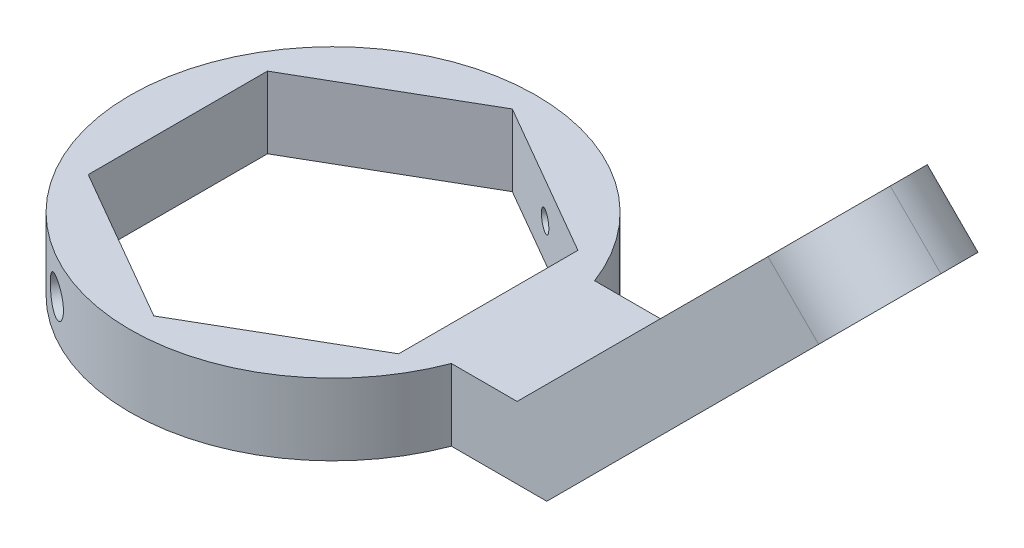
ISO-10303-21;
HEADER;
FILE_DESCRIPTION(('STEP AP214'),'2;1');
FILE_NAME('part.step','',(''),(''),'','','');
FILE_SCHEMA(('AUTOMOTIVE_DESIGN { 1 0 10303 214 1 1 1 1 }'));
ENDSEC;
DATA;
#1=APPLICATION_CONTEXT('core data for automotive mechanical design processes');
#2=APPLICATION_PROTOCOL_DEFINITION('international standard','automotive_design',2000,#1);
#3=PRODUCT_CONTEXT('',#1,'mechanical');
#4=PRODUCT('Part','Part','',(#3));
#5=PRODUCT_RELATED_PRODUCT_CATEGORY('part','',(#4));
#6=PRODUCT_DEFINITION_FORMATION('','',#4);
#7=PRODUCT_DEFINITION_CONTEXT('part definition',#1,'design');
#8=PRODUCT_DEFINITION('design','',#6,#7);
#9=PRODUCT_DEFINITION_SHAPE('','',#8);
#10=(LENGTH_UNIT() NAMED_UNIT(*) SI_UNIT(.MILLI.,.METRE.));
#11=(NAMED_UNIT(*) PLANE_ANGLE_UNIT() SI_UNIT($,.RADIAN.));
#12=(NAMED_UNIT(*) SI_UNIT($,.STERADIAN.) SOLID_ANGLE_UNIT());
#13=UNCERTAINTY_MEASURE_WITH_UNIT(LENGTH_MEASURE(1.E-05),#10,'distance_accuracy_value','');
#14=(GEOMETRIC_REPRESENTATION_CONTEXT(3) GLOBAL_UNCERTAINTY_ASSIGNED_CONTEXT((#13)) GLOBAL_UNIT_ASSIGNED_CONTEXT((#10,
#11,#12)) REPRESENTATION_CONTEXT('',''));
#15=CARTESIAN_POINT('',(0.,0.,0.));
#16=DIRECTION('',(0.,0.,1.));
#17=DIRECTION('',(1.,0.,0.));
#18=AXIS2_PLACEMENT_3D('',#15,#16,#17);
#19=CARTESIAN_POINT('',(0.,12.,0.));
#20=DIRECTION('',(0.,-1.,0.));
#21=DIRECTION('',(0.,0.,-1.));
#22=AXIS2_PLACEMENT_3D('',#19,#20,#21);
#23=CYLINDRICAL_SURFACE('',#22,34.);
#24=CARTESIAN_POINT('',(0.,0.,0.));
#25=DIRECTION('',(0.,1.,0.));
#26=DIRECTION('',(0.,0.,1.));
#27=AXIS2_PLACEMENT_3D('',#24,#25,#26);
#28=CIRCLE('',#27,34.);
#29=CARTESIAN_POINT('',(31.8119474411737,0.,-12.));
#30=VERTEX_POINT('',#29);
#31=CARTESIAN_POINT('',(31.8119474411737,0.,12.));
#32=VERTEX_POINT('',#31);
#33=EDGE_CURVE('E180',#30,#32,#28,.T.);
#34=ORIENTED_EDGE('',*,*,#33,.T.);
#35=DIRECTION('',(0.,-1.,0.));
#36=VECTOR('',#35,1.);
#37=CARTESIAN_POINT('',(31.8119474411737,12.,12.));
#38=LINE('',#37,#36);
#39=CARTESIAN_POINT('',(31.8119474411737,12.,12.));
#40=VERTEX_POINT('',#39);
#41=EDGE_CURVE('E233',#40,#32,#38,.T.);
#42=ORIENTED_EDGE('',*,*,#41,.F.);
#43=CARTESIAN_POINT('',(0.,12.,0.));
#44=DIRECTION('',(0.,1.,0.));
#45=DIRECTION('',(0.,0.,1.));
#46=AXIS2_PLACEMENT_3D('',#43,#44,#45);
#47=CIRCLE('',#46,34.);
#48=CARTESIAN_POINT('',(31.8119474411737,12.,-12.));
#49=VERTEX_POINT('',#48);
#50=EDGE_CURVE('E228',#49,#40,#47,.T.);
#51=ORIENTED_EDGE('',*,*,#50,.F.);
#52=DIRECTION('',(0.,-1.,0.));
#53=VECTOR('',#52,1.);
#54=CARTESIAN_POINT('',(31.8119474411737,12.,-12.));
#55=LINE('',#54,#53);
#56=EDGE_CURVE('E249',#49,#30,#55,.T.);
#57=ORIENTED_EDGE('',*,*,#56,.T.);
#58=EDGE_LOOP('',(#34,#42,#51,#57));
#59=FACE_BOUND('',#58,.T.);
#60=CARTESIAN_POINT('',(19.5317704332293,6.,-27.830018752125));
#61=CARTESIAN_POINT('',(19.5317649613698,6.16815903497814,-27.8300239339166));
#62=CARTESIAN_POINT('',(19.5201176806318,6.33643164423583,-27.8382082143585));
#63=CARTESIAN_POINT('',(19.4737749328198,6.6683183579417,-27.8706451105849));
#64=CARTESIAN_POINT('',(19.4390535471245,6.83192700769336,-27.8949157957835));
#65=CARTESIAN_POINT('',(19.3474211386261,7.14963109542007,-27.9585476731201));
#66=CARTESIAN_POINT('',(19.2905229357072,7.3037319701052,-27.99790014662));
#67=CARTESIAN_POINT('',(19.1559383539736,7.5981371718192,-28.0901521846755));
#68=CARTESIAN_POINT('',(19.0782563323291,7.73844438216431,-28.1430489096817));
#69=CARTESIAN_POINT('',(18.9037762356781,8.00171668159886,-28.2605431914283));
#70=CARTESIAN_POINT('',(18.8069301127904,8.12463682201163,-28.3251701235194));
#71=CARTESIAN_POINT('',(18.5966499580115,8.34925930422787,-28.4636685501938));
#72=CARTESIAN_POINT('',(18.4832151924695,8.45096070712674,-28.5375404536252));
#73=CARTESIAN_POINT('',(18.2424444602952,8.63041022182275,-28.6920491222351));
#74=CARTESIAN_POINT('',(18.1150862089344,8.70811915027042,-28.7726966827462));
#75=CARTESIAN_POINT('',(17.8499653179861,8.83712720805782,-28.9379181872468));
#76=CARTESIAN_POINT('',(17.7122028802147,8.88842684952299,-29.0224920550632));
#77=CARTESIAN_POINT('',(17.4303848491934,8.9630299358413,-29.192613612981));
#78=CARTESIAN_POINT('',(17.2863467143215,8.98640647602842,-29.2781581661385));
#79=CARTESIAN_POINT('',(16.995663635736,9.00472580578764,-29.4478477116573));
#80=CARTESIAN_POINT('',(16.8490187458304,8.99966918159136,-29.5319927328382));
#81=CARTESIAN_POINT('',(16.5577357001919,8.96132537674915,-29.6962839392502));
#82=CARTESIAN_POINT('',(16.4130930956331,8.9281167976441,-29.7764406011236));
#83=CARTESIAN_POINT('',(16.1296126618743,8.83453403526735,-29.9309484054645));
#84=CARTESIAN_POINT('',(15.9907748935588,8.7741595671418,-30.0052994870467));
#85=CARTESIAN_POINT('',(15.722834739252,8.62787162443925,-30.146566354124));
#86=CARTESIAN_POINT('',(15.5937460355973,8.54192306337227,-30.2134717500724));
#87=CARTESIAN_POINT('',(15.3494065860967,8.34695217386185,-30.3383350424967));
#88=CARTESIAN_POINT('',(15.2341561555393,8.23792931985446,-30.3962927351183));
#89=CARTESIAN_POINT('',(15.0206636287877,7.99946185923578,-30.5023597968442));
#90=CARTESIAN_POINT('',(14.9224808264406,7.86994893162906,-30.5504349349692));
#91=CARTESIAN_POINT('',(14.7466960521143,7.59441547999201,-30.6356741370718));
#92=CARTESIAN_POINT('',(14.6690941002381,7.44839493983756,-30.6728381903915));
#93=CARTESIAN_POINT('',(14.5369556991514,7.14394192721177,-30.7356844683052));
#94=CARTESIAN_POINT('',(14.4824226037211,6.98550765398141,-30.7613650234442));
#95=CARTESIAN_POINT('',(14.3982301662586,6.66074831966332,-30.8008628084354));
#96=CARTESIAN_POINT('',(14.3685702369732,6.49442344496996,-30.8146803183732));
#97=CARTESIAN_POINT('',(14.3351671658681,6.15920390069813,-30.8302339817285));
#98=CARTESIAN_POINT('',(14.3313370802111,5.99031977181232,-30.8320106649405));
#99=CARTESIAN_POINT('',(14.3494904008241,5.6542490397517,-30.8235660094671));
#100=CARTESIAN_POINT('',(14.3714735366878,5.48706241881318,-30.8133447964655));
#101=CARTESIAN_POINT('',(14.4404662280679,5.15940801262323,-30.7810715661327));
#102=CARTESIAN_POINT('',(14.4874351826953,4.99892978152493,-30.7590387417165));
#103=CARTESIAN_POINT('',(14.6048396892344,4.68892365623108,-30.7034664367371));
#104=CARTESIAN_POINT('',(14.6752756623604,4.53939595864771,-30.6699267496346));
#105=CARTESIAN_POINT('',(14.8375736638965,4.25509862506024,-30.5917392784767));
#106=CARTESIAN_POINT('',(14.9294921876323,4.12036930379032,-30.5470621839915));
#107=CARTESIAN_POINT('',(15.131755611946,3.86990102366106,-30.4473751095173));
#108=CARTESIAN_POINT('',(15.242100867729,3.75416243096408,-30.3923649303387));
#109=CARTESIAN_POINT('',(15.4781385353261,3.54463389572322,-30.2728383658471));
#110=CARTESIAN_POINT('',(15.603872919827,3.45090611086509,-30.2082958782682));
#111=CARTESIAN_POINT('',(15.8666015441327,3.28848660552547,-30.0711304380419));
#112=CARTESIAN_POINT('',(16.0035956597464,3.21979460895311,-29.9985075745151));
#113=CARTESIAN_POINT('',(16.284523605978,3.10950294936215,-29.8469379864747));
#114=CARTESIAN_POINT('',(16.4284473447589,3.06786509613094,-29.7680003537134));
#115=CARTESIAN_POINT('',(16.7191603564508,3.01273889890919,-29.6056983999315));
#116=CARTESIAN_POINT('',(16.8659495678264,2.99924995109677,-29.522334173905));
#117=CARTESIAN_POINT('',(17.1576461248153,3.00081189851732,-29.3537640023131));
#118=CARTESIAN_POINT('',(17.3025581683226,3.0157660289488,-29.2685652725718));
#119=CARTESIAN_POINT('',(17.5869459810474,3.07358754255125,-29.0985701737762));
#120=CARTESIAN_POINT('',(17.7264217436474,3.11645495969946,-29.0137738052116));
#121=CARTESIAN_POINT('',(17.9961363853677,3.22886096678845,-28.8472566100504));
#122=CARTESIAN_POINT('',(18.126375974515,3.29839750391216,-28.765535547268));
#123=CARTESIAN_POINT('',(18.3742088166986,3.46215705310636,-28.6078669133873));
#124=CARTESIAN_POINT('',(18.4918022347339,3.55637974303279,-28.531919266965));
#125=CARTESIAN_POINT('',(18.7117119901493,3.76720034401749,-28.3881872834287));
#126=CARTESIAN_POINT('',(18.8139773897487,3.88387004062032,-28.3204303036535));
#127=CARTESIAN_POINT('',(19.0002379030546,4.13613887842538,-28.1958073790655));
#128=CARTESIAN_POINT('',(19.0842285977633,4.27174258506649,-28.1389440688423));
#129=CARTESIAN_POINT('',(19.2319890386556,4.55832427288992,-28.0381639573049));
#130=CARTESIAN_POINT('',(19.2957168815561,4.70933327161416,-27.9942739977018));
#131=CARTESIAN_POINT('',(19.4010916941799,5.02211253982181,-27.9213499923651));
#132=CARTESIAN_POINT('',(19.4427639187086,5.18387026144033,-27.8922989566454));
#133=CARTESIAN_POINT('',(19.4924809003155,5.45547664523313,-27.8575612916013));
#134=CARTESIAN_POINT('',(19.5071973378516,5.56358120217121,-27.8472511750996));
#135=CARTESIAN_POINT('',(19.5268438702982,5.78110779821581,-27.8334782292593));
#136=CARTESIAN_POINT('',(19.5317739953653,5.89052983326146,-27.8300153788208));
#137=CARTESIAN_POINT('',(19.5317704332293,6.,-27.830018752125));
#138=B_SPLINE_CURVE_WITH_KNOTS('',3,(#60,#61,#62,#63,#64,#65,#66,#67,#68,#69,#70,#71,#72,#73,
#74,#75,#76,#77,#78,#79,#80,#81,#82,#83,#84,#85,#86,#87,#88,#89,#90,#91,#92,#93,#94,#95,#96,#97,
#98,#99,#100,#101,#102,#103,#104,#105,#106,#107,#108,#109,#110,#111,#112,#113,#114,#115,#116,
#117,#118,#119,#120,#121,#122,#123,#124,#125,#126,#127,#128,#129,#130,#131,#132,#133,#134,#135,
#136,#137),.UNSPECIFIED.,.T.,.F.,(4,2,2,2,2,2,2,2,2,2,2,2,2,2,2,2,2,2,2,2,2,2,2,2,2,2,2,2,2,2,2,
2,2,2,2,2,2,2,4),(0.,0.50407739004379,1.0087219580768,1.51307523487028,2.01732286055947,
2.52285112112668,3.02840174599334,3.53477369693406,4.04113582800653,4.54616951081659,
5.05119278094008,5.55481062959439,6.05843375916665,6.56275104781059,7.06707982454265,
7.57312709501864,8.07917485979014,8.58529616917757,9.09140552874945,9.59581045876575,
10.1002101049382,10.6037926157105,11.1073841658771,11.6123152790278,12.117256126668,
12.6236062069244,13.1299507030602,13.6355788704962,14.141196191596,14.6450964529794,
15.1489973277329,15.6528594232247,16.1567149438524,16.6622094142381,17.1678259824949,
17.6744814585412,18.1805555262344,18.5087068265025,18.836857115569),.UNSPECIFIED.);
#139=CARTESIAN_POINT('',(19.5317704332293,6.,-27.830018752125));
#140=VERTEX_POINT('',#139);
#141=EDGE_CURVE('E280',#140,#140,#138,.T.);
#142=ORIENTED_EDGE('',*,*,#141,.T.);
#143=EDGE_LOOP('',(#142));
#144=FACE_BOUND('',#143,.T.);
#145=CARTESIAN_POINT('',(-19.5317704332293,6.,27.830018752125));
#146=CARTESIAN_POINT('',(-19.5317649613699,5.83184096502186,27.8300239339166));
#147=CARTESIAN_POINT('',(-19.5201176806318,5.66356835576417,27.8382082143585));
#148=CARTESIAN_POINT('',(-19.4737749328198,5.3316816420583,27.8706451105849));
#149=CARTESIAN_POINT('',(-19.4390535471245,5.16807299230664,27.8949157957835));
#150=CARTESIAN_POINT('',(-19.3474211386261,4.85036890457993,27.9585476731201));
#151=CARTESIAN_POINT('',(-19.2905229357072,4.6962680298948,27.99790014662));
#152=CARTESIAN_POINT('',(-19.1559383539737,4.40186282818079,28.0901521846755));
#153=CARTESIAN_POINT('',(-19.0782563323291,4.26155561783568,28.1430489096817));
#154=CARTESIAN_POINT('',(-18.9037762356781,3.99828331840114,28.2605431914283));
#155=CARTESIAN_POINT('',(-18.8069301127904,3.87536317798837,28.3251701235194));
#156=CARTESIAN_POINT('',(-18.5966499580115,3.65074069577213,28.4636685501938));
#157=CARTESIAN_POINT('',(-18.4832151924696,3.54903929287325,28.5375404536252));
#158=CARTESIAN_POINT('',(-18.2424444602952,3.36958977817725,28.6920491222351));
#159=CARTESIAN_POINT('',(-18.1150862089344,3.29188084972958,28.7726966827462));
#160=CARTESIAN_POINT('',(-17.8499653179861,3.16287279194218,28.9379181872468));
#161=CARTESIAN_POINT('',(-17.7122028802147,3.11157315047701,29.0224920550632));
#162=CARTESIAN_POINT('',(-17.4303848491934,3.0369700641587,29.192613612981));
#163=CARTESIAN_POINT('',(-17.2863467143215,3.01359352397158,29.2781581661385));
#164=CARTESIAN_POINT('',(-16.9956636357361,2.99527419421236,29.4478477116573));
#165=CARTESIAN_POINT('',(-16.8490187458304,3.00033081840864,29.5319927328382));
#166=CARTESIAN_POINT('',(-16.5577357001919,3.03867462325085,29.6962839392502));
#167=CARTESIAN_POINT('',(-16.4130930956331,3.0718832023559,29.7764406011236));
#168=CARTESIAN_POINT('',(-16.1296126618743,3.16546596473265,29.9309484054645));
#169=CARTESIAN_POINT('',(-15.9907748935588,3.2258404328582,30.0052994870467));
#170=CARTESIAN_POINT('',(-15.722834739252,3.37212837556075,30.1465663541239));
#171=CARTESIAN_POINT('',(-15.5937460355973,3.45807693662773,30.2134717500724));
#172=CARTESIAN_POINT('',(-15.3494065860967,3.65304782613816,30.3383350424967));
#173=CARTESIAN_POINT('',(-15.2341561555393,3.76207068014554,30.3962927351183));
#174=CARTESIAN_POINT('',(-15.0206636287877,4.00053814076422,30.5023597968441));
#175=CARTESIAN_POINT('',(-14.9224808264406,4.13005106837094,30.5504349349692));
#176=CARTESIAN_POINT('',(-14.7466960521143,4.405584520008,30.6356741370718));
#177=CARTESIAN_POINT('',(-14.6690941002381,4.55160506016244,30.6728381903915));
#178=CARTESIAN_POINT('',(-14.5369556991514,4.85605807278823,30.7356844683051));
#179=CARTESIAN_POINT('',(-14.4824226037211,5.01449234601859,30.7613650234442));
#180=CARTESIAN_POINT('',(-14.3982301662586,5.33925168033668,30.8008628084354));
#181=CARTESIAN_POINT('',(-14.3685702369732,5.50557655503004,30.8146803183731));
#182=CARTESIAN_POINT('',(-14.3351671658681,5.84079609930187,30.8302339817285));
#183=CARTESIAN_POINT('',(-14.3313370802111,6.00968022818769,30.8320106649405));
#184=CARTESIAN_POINT('',(-14.3494904008241,6.3457509602483,30.8235660094671));
#185=CARTESIAN_POINT('',(-14.3714735366878,6.51293758118683,30.8133447964655));
#186=CARTESIAN_POINT('',(-14.4404662280679,6.84059198737677,30.7810715661327));
#187=CARTESIAN_POINT('',(-14.4874351826953,7.00107021847507,30.7590387417165));
#188=CARTESIAN_POINT('',(-14.6048396892344,7.31107634376892,30.7034664367371));
#189=CARTESIAN_POINT('',(-14.6752756623604,7.46060404135229,30.6699267496346));
#190=CARTESIAN_POINT('',(-14.8375736638965,7.74490137493976,30.5917392784767));
#191=CARTESIAN_POINT('',(-14.9294921876324,7.87963069620968,30.5470621839915));
#192=CARTESIAN_POINT('',(-15.131755611946,8.13009897633894,30.4473751095173));
#193=CARTESIAN_POINT('',(-15.242100867729,8.24583756903593,30.3923649303387));
#194=CARTESIAN_POINT('',(-15.4781385353261,8.45536610427679,30.2728383658471));
#195=CARTESIAN_POINT('',(-15.603872919827,8.54909388913492,30.2082958782682));
#196=CARTESIAN_POINT('',(-15.8666015441327,8.71151339447454,30.0711304380419));
#197=CARTESIAN_POINT('',(-16.0035956597464,8.78020539104689,29.9985075745151));
#198=CARTESIAN_POINT('',(-16.284523605978,8.89049705063785,29.8469379864747));
#199=CARTESIAN_POINT('',(-16.428447344759,8.93213490386907,29.7680003537134));
#200=CARTESIAN_POINT('',(-16.7191603564509,8.98726110109081,29.6056983999315));
#201=CARTESIAN_POINT('',(-16.8659495678265,9.00075004890323,29.522334173905));
#202=CARTESIAN_POINT('',(-17.1576461248154,8.99918810148269,29.3537640023131));
#203=CARTESIAN_POINT('',(-17.3025581683226,8.9842339710512,29.2685652725718));
#204=CARTESIAN_POINT('',(-17.5869459810474,8.92641245744875,29.0985701737761));
#205=CARTESIAN_POINT('',(-17.7264217436474,8.88354504030054,29.0137738052116));
#206=CARTESIAN_POINT('',(-17.9961363853677,8.77113903321155,28.8472566100504));
#207=CARTESIAN_POINT('',(-18.126375974515,8.70160249608784,28.765535547268));
#208=CARTESIAN_POINT('',(-18.3742088166986,8.53784294689364,28.6078669133873));
#209=CARTESIAN_POINT('',(-18.4918022347339,8.44362025696721,28.531919266965));
#210=CARTESIAN_POINT('',(-18.7117119901493,8.23279965598251,28.3881872834287));
#211=CARTESIAN_POINT('',(-18.8139773897487,8.11612995937969,28.3204303036535));
#212=CARTESIAN_POINT('',(-19.0002379030546,7.86386112157462,28.1958073790655));
#213=CARTESIAN_POINT('',(-19.0842285977633,7.7282574149335,28.1389440688423));
#214=CARTESIAN_POINT('',(-19.2319890386556,7.44167572711008,28.0381639573048));
#215=CARTESIAN_POINT('',(-19.2957168815561,7.29066672838584,27.9942739977018));
#216=CARTESIAN_POINT('',(-19.4010916941799,6.97788746017819,27.9213499923651));
#217=CARTESIAN_POINT('',(-19.4427639187087,6.81612973855967,27.8922989566454));
#218=CARTESIAN_POINT('',(-19.4924809003155,6.54452335476687,27.8575612916013));
#219=CARTESIAN_POINT('',(-19.5071973378516,6.43641879782879,27.8472511750996));
#220=CARTESIAN_POINT('',(-19.5268438702983,6.21889220178419,27.8334782292593));
#221=CARTESIAN_POINT('',(-19.5317739953653,6.10947016673854,27.8300153788208));
#222=CARTESIAN_POINT('',(-19.5317704332293,6.,27.830018752125));
#223=B_SPLINE_CURVE_WITH_KNOTS('',3,(#145,#146,#147,#148,#149,#150,#151,#152,#153,#154,#155,
#156,#157,#158,#159,#160,#161,#162,#163,#164,#165,#166,#167,#168,#169,#170,#171,#172,#173,#174,
#175,#176,#177,#178,#179,#180,#181,#182,#183,#184,#185,#186,#187,#188,#189,#190,#191,#192,#193,
#194,#195,#196,#197,#198,#199,#200,#201,#202,#203,#204,#205,#206,#207,#208,#209,#210,#211,#212,
#213,#214,#215,#216,#217,#218,#219,#220,#221,#222),.UNSPECIFIED.,.T.,.F.,(4,2,2,2,2,2,2,2,2,2,2,
2,2,2,2,2,2,2,2,2,2,2,2,2,2,2,2,2,2,2,2,2,2,2,2,2,2,2,4),(0.,0.504077390043789,1.0087219580768,
1.51307523487028,2.01732286055947,2.52285112112668,3.02840174599335,3.53477369693406,
4.04113582800654,4.5461695108166,5.05119278094008,5.5548106295944,6.05843375916666,
6.5627510478106,7.06707982454266,7.57312709501864,8.07917485979015,8.58529616917757,
9.09140552874945,9.59581045876575,10.1002101049382,10.6037926157105,11.1073841658771,
11.6123152790278,12.117256126668,12.6236062069244,13.1299507030602,13.6355788704962,
14.141196191596,14.6450964529794,15.1489973277329,15.6528594232247,16.1567149438524,
16.6622094142381,17.1678259824949,17.6744814585412,18.1805555262344,18.5087068265025,
18.836857115569),.UNSPECIFIED.);
#224=CARTESIAN_POINT('',(-19.5317704332293,6.,27.830018752125));
#225=VERTEX_POINT('',#224);
#226=EDGE_CURVE('E72',#225,#225,#223,.T.);
#227=ORIENTED_EDGE('',*,*,#226,.F.);
#228=EDGE_LOOP('',(#227));
#229=FACE_BOUND('',#228,.T.);
#230=ADVANCED_FACE('F68',(#59,#144,#229),#23,.T.);
#231=CARTESIAN_POINT('',(82.0147186257615,51.1852813742386,0.));
#232=DIRECTION('',(0.707106781186549,-0.707106781186546,0.));
#233=DIRECTION('',(0.707106781186546,0.707106781186549,0.));
#234=AXIS2_PLACEMENT_3D('',#231,#232,#233);
#235=CYLINDRICAL_SURFACE('',#234,4.);
#236=CARTESIAN_POINT('',(82.0147186257615,51.1852813742386,0.));
#237=DIRECTION('',(0.707106781186549,-0.707106781186546,0.));
#238=DIRECTION('',(0.707106781186546,0.707106781186549,0.));
#239=AXIS2_PLACEMENT_3D('',#236,#237,#238);
#240=CIRCLE('',#239,4.);
#241=CARTESIAN_POINT('',(84.8431457505076,54.0137084989848,0.));
#242=VERTEX_POINT('',#241);
#243=EDGE_CURVE('E195',#242,#242,#240,.T.);
#244=ORIENTED_EDGE('',*,*,#243,.F.);
#245=EDGE_LOOP('',(#244));
#246=FACE_BOUND('',#245,.T.);
#247=CARTESIAN_POINT('',(86.8584000768893,46.3415999231107,0.));
#248=DIRECTION('',(0.707106781186549,-0.707106781186546,0.));
#249=DIRECTION('',(0.707106781186546,0.707106781186549,0.));
#250=AXIS2_PLACEMENT_3D('',#247,#248,#249);
#251=CIRCLE('',#250,4.);
#252=CARTESIAN_POINT('',(89.6868272016355,49.1700270478569,0.));
#253=VERTEX_POINT('',#252);
#254=EDGE_CURVE('E274',#253,#253,#251,.T.);
#255=ORIENTED_EDGE('',*,*,#254,.T.);
#256=EDGE_LOOP('',(#255));
#257=FACE_BOUND('',#256,.T.);
#258=ADVANCED_FACE('F312',(#246,#257),#235,.F.);
#259=CARTESIAN_POINT('',(0.,12.,0.));
#260=DIRECTION('',(0.,1.,0.));
#261=DIRECTION('',(0.,0.,1.));
#262=AXIS2_PLACEMENT_3D('',#259,#260,#261);
#263=PLANE('',#262);
#264=DIRECTION('',(-0.866025403784442,0.,-0.499999999999995));
#265=VECTOR('',#264,1.);
#266=CARTESIAN_POINT('',(12.9999999999999,12.,-22.5166604983955));
#267=LINE('',#266,#265);
#268=CARTESIAN_POINT('',(25.9999999999998,12.,-15.0111069989306));
#269=VERTEX_POINT('',#268);
#270=CARTESIAN_POINT('',(0.,12.,-30.0222139978605));
#271=VERTEX_POINT('',#270);
#272=EDGE_CURVE('E423',#269,#271,#267,.T.);
#273=ORIENTED_EDGE('',*,*,#272,.F.);
#274=DIRECTION('',(0.,0.,-1.));
#275=VECTOR('',#274,1.);
#276=CARTESIAN_POINT('',(26.,12.,-2.73421256970162E-13));
#277=LINE('',#276,#275);
#278=CARTESIAN_POINT('',(26.0000000000001,12.,15.01110699893));
#279=VERTEX_POINT('',#278);
#280=EDGE_CURVE('E427',#279,#269,#277,.T.);
#281=ORIENTED_EDGE('',*,*,#280,.F.);
#282=DIRECTION('',(0.866025403784435,0.,-0.500000000000007));
#283=VECTOR('',#282,1.);
#284=CARTESIAN_POINT('',(13.0000000000002,12.,22.5166604983953));
#285=LINE('',#284,#283);
#286=CARTESIAN_POINT('',(2.09901540593194E-13,12.,30.0222139978605));
#287=VERTEX_POINT('',#286);
#288=EDGE_CURVE('E431',#287,#279,#285,.T.);
#289=ORIENTED_EDGE('',*,*,#288,.F.);
#290=DIRECTION('',(0.866025403784442,0.,0.499999999999995));
#291=VECTOR('',#290,1.);
#292=CARTESIAN_POINT('',(-12.9999999999999,12.,22.5166604983955));
#293=LINE('',#292,#291);
#294=CARTESIAN_POINT('',(-25.9999999999999,12.,15.0111069989304));
#295=VERTEX_POINT('',#294);
#296=EDGE_CURVE('E435',#295,#287,#293,.T.);
#297=ORIENTED_EDGE('',*,*,#296,.F.);
#298=DIRECTION('',(0.,0.,1.));
#299=VECTOR('',#298,1.);
#300=CARTESIAN_POINT('',(-26.,12.,0.));
#301=LINE('',#300,#299);
#302=CARTESIAN_POINT('',(-26.,12.,-15.0111069989302));
#303=VERTEX_POINT('',#302);
#304=EDGE_CURVE('E439',#303,#295,#301,.T.);
#305=ORIENTED_EDGE('',*,*,#304,.F.);
#306=DIRECTION('',(-0.866025403784438,0.,0.500000000000001));
#307=VECTOR('',#306,1.);
#308=CARTESIAN_POINT('',(-13.,12.,-22.5166604983954));
#309=LINE('',#308,#307);
#310=EDGE_CURVE('E252',#271,#303,#309,.T.);
#311=ORIENTED_EDGE('',*,*,#310,.F.);
#312=EDGE_LOOP('',(#273,#281,#289,#297,#305,#311));
#313=FACE_BOUND('',#312,.T.);
#314=DIRECTION('',(1.,0.,0.));
#315=VECTOR('',#314,1.);
#316=CARTESIAN_POINT('',(0.,12.,12.));
#317=LINE('',#316,#315);
#318=CARTESIAN_POINT('',(42.8294372515231,12.,12.));
#319=VERTEX_POINT('',#318);
#320=EDGE_CURVE('E416',#40,#319,#317,.T.);
#321=ORIENTED_EDGE('',*,*,#320,.T.);
#322=DIRECTION('',(0.,0.,-1.));
#323=VECTOR('',#322,1.);
#324=CARTESIAN_POINT('',(42.8294372515231,12.,0.));
#325=LINE('',#324,#323);
#326=CARTESIAN_POINT('',(42.8294372515231,12.,-12.));
#327=VERTEX_POINT('',#326);
#328=EDGE_CURVE('E248',#319,#327,#325,.T.);
#329=ORIENTED_EDGE('',*,*,#328,.T.);
#330=DIRECTION('',(1.,0.,0.));
#331=VECTOR('',#330,1.);
#332=CARTESIAN_POINT('',(0.,12.,-12.));
#333=LINE('',#332,#331);
#334=EDGE_CURVE('E419',#49,#327,#333,.T.);
#335=ORIENTED_EDGE('',*,*,#334,.F.);
#336=ORIENTED_EDGE('',*,*,#50,.T.);
#337=EDGE_LOOP('',(#321,#329,#335,#336));
#338=FACE_BOUND('',#337,.T.);
#339=ADVANCED_FACE('F315',(#313,#338),#263,.T.);
#340=CARTESIAN_POINT('',(12.9999999999999,12.,-22.5166604983955));
#341=DIRECTION('',(-0.499999999999995,0.,0.866025403784441));
#342=DIRECTION('',(0.866025403784441,0.,0.499999999999995));
#343=AXIS2_PLACEMENT_3D('',#340,#341,#342);
#344=PLANE('',#343);
#345=CARTESIAN_POINT('',(12.9999999999999,6.,-22.5166604983956));
#346=DIRECTION('',(-0.499999999999995,0.,0.866025403784442));
#347=DIRECTION('',(0.866025403784442,0.,0.499999999999995));
#348=AXIS2_PLACEMENT_3D('',#345,#346,#347);
#349=CIRCLE('',#348,1.7);
#350=CARTESIAN_POINT('',(14.4722431864335,6.,-21.6666604983956));
#351=VERTEX_POINT('',#350);
#352=EDGE_CURVE('E275',#351,#351,#349,.T.);
#353=ORIENTED_EDGE('',*,*,#352,.F.);
#354=EDGE_LOOP('',(#353));
#355=FACE_BOUND('',#354,.T.);
#356=DIRECTION('',(-0.866025403784442,0.,-0.499999999999995));
#357=VECTOR('',#356,1.);
#358=CARTESIAN_POINT('',(12.9999999999999,0.,-22.5166604983955));
#359=LINE('',#358,#357);
#360=CARTESIAN_POINT('',(25.9999999999998,0.,-15.0111069989306));
#361=VERTEX_POINT('',#360);
#362=CARTESIAN_POINT('',(0.,0.,-30.0222139978605));
#363=VERTEX_POINT('',#362);
#364=EDGE_CURVE('E183',#361,#363,#359,.T.);
#365=ORIENTED_EDGE('',*,*,#364,.F.);
#366=DIRECTION('',(0.,-1.,0.));
#367=VECTOR('',#366,1.);
#368=CARTESIAN_POINT('',(25.9999999999998,12.,-15.0111069989306));
#369=LINE('',#368,#367);
#370=EDGE_CURVE('E245',#269,#361,#369,.T.);
#371=ORIENTED_EDGE('',*,*,#370,.F.);
#372=ORIENTED_EDGE('',*,*,#272,.T.);
#373=DIRECTION('',(0.,-1.,0.));
#374=VECTOR('',#373,1.);
#375=CARTESIAN_POINT('',(0.,12.,-30.0222139978605));
#376=LINE('',#375,#374);
#377=EDGE_CURVE('E229',#271,#363,#376,.T.);
#378=ORIENTED_EDGE('',*,*,#377,.T.);
#379=EDGE_LOOP('',(#365,#371,#372,#378));
#380=FACE_BOUND('',#379,.T.);
#381=ADVANCED_FACE('F325',(#355,#380),#344,.T.);
#382=CARTESIAN_POINT('',(26.,12.,-2.73421256970162E-13));
#383=DIRECTION('',(-1.,0.,0.));
#384=DIRECTION('',(0.,0.,1.));
#385=AXIS2_PLACEMENT_3D('',#382,#383,#384);
#386=PLANE('',#385);
#387=DIRECTION('',(0.,0.,-1.));
#388=VECTOR('',#387,1.);
#389=CARTESIAN_POINT('',(26.,0.,-2.73421256970162E-13));
#390=LINE('',#389,#388);
#391=CARTESIAN_POINT('',(26.0000000000001,0.,15.01110699893));
#392=VERTEX_POINT('',#391);
#393=EDGE_CURVE('E208',#392,#361,#390,.T.);
#394=ORIENTED_EDGE('',*,*,#393,.F.);
#395=DIRECTION('',(0.,-1.,0.));
#396=VECTOR('',#395,1.);
#397=CARTESIAN_POINT('',(26.0000000000001,12.,15.01110699893));
#398=LINE('',#397,#396);
#399=EDGE_CURVE('E242',#279,#392,#398,.T.);
#400=ORIENTED_EDGE('',*,*,#399,.F.);
#401=ORIENTED_EDGE('',*,*,#280,.T.);
#402=ORIENTED_EDGE('',*,*,#370,.T.);
#403=EDGE_LOOP('',(#394,#400,#401,#402));
#404=FACE_BOUND('',#403,.T.);
#405=ADVANCED_FACE('F345',(#404),#386,.T.);
#406=CARTESIAN_POINT('',(13.0000000000002,12.,22.5166604983953));
#407=DIRECTION('',(-0.500000000000007,0.,-0.866025403784435));
#408=DIRECTION('',(-0.866025403784435,0.,0.500000000000007));
#409=AXIS2_PLACEMENT_3D('',#406,#407,#408);
#410=PLANE('',#409);
#411=DIRECTION('',(0.866025403784435,0.,-0.500000000000007));
#412=VECTOR('',#411,1.);
#413=CARTESIAN_POINT('',(13.0000000000002,0.,22.5166604983953));
#414=LINE('',#413,#412);
#415=CARTESIAN_POINT('',(2.09901540593194E-13,0.,30.0222139978605));
#416=VERTEX_POINT('',#415);
#417=EDGE_CURVE('E212',#416,#392,#414,.T.);
#418=ORIENTED_EDGE('',*,*,#417,.F.);
#419=DIRECTION('',(0.,-1.,0.));
#420=VECTOR('',#419,1.);
#421=CARTESIAN_POINT('',(2.09901540593194E-13,12.,30.0222139978605));
#422=LINE('',#421,#420);
#423=EDGE_CURVE('E239',#287,#416,#422,.T.);
#424=ORIENTED_EDGE('',*,*,#423,.F.);
#425=ORIENTED_EDGE('',*,*,#288,.T.);
#426=ORIENTED_EDGE('',*,*,#399,.T.);
#427=EDGE_LOOP('',(#418,#424,#425,#426));
#428=FACE_BOUND('',#427,.T.);
#429=ADVANCED_FACE('F341',(#428),#410,.T.);
#430=CARTESIAN_POINT('',(-12.9999999999999,12.,22.5166604983955));
#431=DIRECTION('',(0.499999999999995,0.,-0.866025403784441));
#432=DIRECTION('',(-0.866025403784442,0.,-0.499999999999995));
#433=AXIS2_PLACEMENT_3D('',#430,#431,#432);
#434=PLANE('',#433);
#435=CARTESIAN_POINT('',(-12.9999999999999,6.,22.5166604983956));
#436=DIRECTION('',(-0.499999999999995,0.,0.866025403784442));
#437=DIRECTION('',(0.866025403784442,0.,0.499999999999995));
#438=AXIS2_PLACEMENT_3D('',#435,#436,#437);
#439=CIRCLE('',#438,1.7);
#440=CARTESIAN_POINT('',(-11.5277568135664,6.,23.3666604983956));
#441=VERTEX_POINT('',#440);
#442=EDGE_CURVE('E370',#441,#441,#439,.T.);
#443=ORIENTED_EDGE('',*,*,#442,.T.);
#444=EDGE_LOOP('',(#443));
#445=FACE_BOUND('',#444,.T.);
#446=DIRECTION('',(0.866025403784442,0.,0.499999999999995));
#447=VECTOR('',#446,1.);
#448=CARTESIAN_POINT('',(-12.9999999999999,0.,22.5166604983955));
#449=LINE('',#448,#447);
#450=CARTESIAN_POINT('',(-25.9999999999999,0.,15.0111069989304));
#451=VERTEX_POINT('',#450);
#452=EDGE_CURVE('E216',#451,#416,#449,.T.);
#453=ORIENTED_EDGE('',*,*,#452,.F.);
#454=DIRECTION('',(0.,-1.,0.));
#455=VECTOR('',#454,1.);
#456=CARTESIAN_POINT('',(-25.9999999999999,12.,15.0111069989304));
#457=LINE('',#456,#455);
#458=EDGE_CURVE('E236',#295,#451,#457,.T.);
#459=ORIENTED_EDGE('',*,*,#458,.F.);
#460=ORIENTED_EDGE('',*,*,#296,.T.);
#461=ORIENTED_EDGE('',*,*,#423,.T.);
#462=EDGE_LOOP('',(#453,#459,#460,#461));
#463=FACE_BOUND('',#462,.T.);
#464=ADVANCED_FACE('F337',(#445,#463),#434,.T.);
#465=CARTESIAN_POINT('',(-26.,12.,0.));
#466=DIRECTION('',(1.,0.,0.));
#467=DIRECTION('',(0.,0.,-1.));
#468=AXIS2_PLACEMENT_3D('',#465,#466,#467);
#469=PLANE('',#468);
#470=DIRECTION('',(0.,0.,1.));
#471=VECTOR('',#470,1.);
#472=CARTESIAN_POINT('',(-26.,0.,0.));
#473=LINE('',#472,#471);
#474=CARTESIAN_POINT('',(-26.,0.,-15.0111069989302));
#475=VERTEX_POINT('',#474);
#476=EDGE_CURVE('E220',#475,#451,#473,.T.);
#477=ORIENTED_EDGE('',*,*,#476,.F.);
#478=DIRECTION('',(0.,-1.,0.));
#479=VECTOR('',#478,1.);
#480=CARTESIAN_POINT('',(-26.,12.,-15.0111069989302));
#481=LINE('',#480,#479);
#482=EDGE_CURVE('E232',#303,#475,#481,.T.);
#483=ORIENTED_EDGE('',*,*,#482,.F.);
#484=ORIENTED_EDGE('',*,*,#304,.T.);
#485=ORIENTED_EDGE('',*,*,#458,.T.);
#486=EDGE_LOOP('',(#477,#483,#484,#485));
#487=FACE_BOUND('',#486,.T.);
#488=ADVANCED_FACE('F333',(#487),#469,.T.);
#489=CARTESIAN_POINT('',(0.,12.,12.));
#490=DIRECTION('',(0.,0.,-1.));
#491=DIRECTION('',(-1.,0.,0.));
#492=AXIS2_PLACEMENT_3D('',#489,#490,#491);
#493=PLANE('',#492);
#494=DIRECTION('',(0.707106781186546,0.707106781186549,0.));
#495=VECTOR('',#494,1.);
#496=CARTESIAN_POINT('',(47.8000000000002,0.,12.));
#497=LINE('',#496,#495);
#498=CARTESIAN_POINT('',(47.8000000000002,0.,12.));
#499=VERTEX_POINT('',#498);
#500=CARTESIAN_POINT('',(93.3284271247462,45.5284271247462,12.));
#501=VERTEX_POINT('',#500);
#502=EDGE_CURVE('E194',#499,#501,#497,.T.);
#503=ORIENTED_EDGE('',*,*,#502,.T.);
#504=DIRECTION('',(0.707106781186549,-0.707106781186546,0.));
#505=VECTOR('',#504,1.);
#506=CARTESIAN_POINT('',(63.428427124746,75.4284271247463,12.));
#507=LINE('',#506,#505);
#508=CARTESIAN_POINT('',(84.8431457505076,54.0137084989848,12.));
#509=VERTEX_POINT('',#508);
#510=EDGE_CURVE('E12',#501,#509,#507,.F.);
#511=ORIENTED_EDGE('',*,*,#510,.T.);
#512=DIRECTION('',(0.707106781186546,0.707106781186549,0.));
#513=VECTOR('',#512,1.);
#514=CARTESIAN_POINT('',(39.3147186257616,8.48528137423855,12.));
#515=LINE('',#514,#513);
#516=EDGE_CURVE('E408',#319,#509,#515,.T.);
#517=ORIENTED_EDGE('',*,*,#516,.F.);
#518=ORIENTED_EDGE('',*,*,#320,.F.);
#519=ORIENTED_EDGE('',*,*,#41,.T.);
#520=DIRECTION('',(1.,0.,0.));
#521=VECTOR('',#520,1.);
#522=CARTESIAN_POINT('',(0.,0.,12.));
#523=LINE('',#522,#521);
#524=EDGE_CURVE('E199',#32,#499,#523,.T.);
#525=ORIENTED_EDGE('',*,*,#524,.T.);
#526=EDGE_LOOP('',(#503,#511,#517,#518,#519,#525));
#527=FACE_BOUND('',#526,.T.);
#528=ADVANCED_FACE('F336',(#527),#493,.F.);
#529=CARTESIAN_POINT('',(0.,12.,-12.));
#530=DIRECTION('',(0.,0.,-1.));
#531=DIRECTION('',(-1.,0.,0.));
#532=AXIS2_PLACEMENT_3D('',#529,#530,#531);
#533=PLANE('',#532);
#534=DIRECTION('',(0.707106781186546,0.707106781186549,0.));
#535=VECTOR('',#534,1.);
#536=CARTESIAN_POINT('',(39.3147186257616,8.48528137423855,-12.));
#537=LINE('',#536,#535);
#538=CARTESIAN_POINT('',(84.8431457505076,54.0137084989848,-12.));
#539=VERTEX_POINT('',#538);
#540=EDGE_CURVE('E405',#327,#539,#537,.T.);
#541=ORIENTED_EDGE('',*,*,#540,.T.);
#542=DIRECTION('',(0.707106781186549,-0.707106781186546,0.));
#543=VECTOR('',#542,1.);
#544=CARTESIAN_POINT('',(93.3284271247462,45.5284271247462,-12.));
#545=LINE('',#544,#543);
#546=CARTESIAN_POINT('',(93.3284271247462,45.5284271247462,-12.));
#547=VERTEX_POINT('',#546);
#548=EDGE_CURVE('E191',#539,#547,#545,.T.);
#549=ORIENTED_EDGE('',*,*,#548,.T.);
#550=DIRECTION('',(0.707106781186546,0.707106781186549,0.));
#551=VECTOR('',#550,1.);
#552=CARTESIAN_POINT('',(47.8000000000002,0.,-12.));
#553=LINE('',#552,#551);
#554=CARTESIAN_POINT('',(47.8000000000002,0.,-12.));
#555=VERTEX_POINT('',#554);
#556=EDGE_CURVE('E187',#555,#547,#553,.T.);
#557=ORIENTED_EDGE('',*,*,#556,.F.);
#558=DIRECTION('',(1.,0.,0.));
#559=VECTOR('',#558,1.);
#560=CARTESIAN_POINT('',(0.,0.,-12.));
#561=LINE('',#560,#559);
#562=EDGE_CURVE('E172',#30,#555,#561,.T.);
#563=ORIENTED_EDGE('',*,*,#562,.F.);
#564=ORIENTED_EDGE('',*,*,#56,.F.);
#565=ORIENTED_EDGE('',*,*,#334,.T.);
#566=EDGE_LOOP('',(#541,#549,#557,#563,#564,#565));
#567=FACE_BOUND('',#566,.T.);
#568=ADVANCED_FACE('F189',(#567),#533,.T.);
#569=CARTESIAN_POINT('',(-13.,12.,-22.5166604983954));
#570=DIRECTION('',(0.500000000000001,0.,0.866025403784438));
#571=DIRECTION('',(0.866025403784438,0.,-0.500000000000001));
#572=AXIS2_PLACEMENT_3D('',#569,#570,#571);
#573=PLANE('',#572);
#574=DIRECTION('',(-0.866025403784438,0.,0.500000000000001));
#575=VECTOR('',#574,1.);
#576=CARTESIAN_POINT('',(-13.,0.,-22.5166604983954));
#577=LINE('',#576,#575);
#578=EDGE_CURVE('E224',#363,#475,#577,.T.);
#579=ORIENTED_EDGE('',*,*,#578,.F.);
#580=ORIENTED_EDGE('',*,*,#377,.F.);
#581=ORIENTED_EDGE('',*,*,#310,.T.);
#582=ORIENTED_EDGE('',*,*,#482,.T.);
#583=EDGE_LOOP('',(#579,#580,#581,#582));
#584=FACE_BOUND('',#583,.T.);
#585=ADVANCED_FACE('F329',(#584),#573,.T.);
#586=CARTESIAN_POINT('',(0.,0.,0.));
#587=DIRECTION('',(0.,1.,0.));
#588=DIRECTION('',(0.,0.,1.));
#589=AXIS2_PLACEMENT_3D('',#586,#587,#588);
#590=PLANE('',#589);
#591=ORIENTED_EDGE('',*,*,#33,.F.);
#592=ORIENTED_EDGE('',*,*,#562,.T.);
#593=DIRECTION('',(0.,0.,-1.));
#594=VECTOR('',#593,1.);
#595=CARTESIAN_POINT('',(47.8000000000002,0.,0.));
#596=LINE('',#595,#594);
#597=EDGE_CURVE('E177',#499,#555,#596,.T.);
#598=ORIENTED_EDGE('',*,*,#597,.F.);
#599=ORIENTED_EDGE('',*,*,#524,.F.);
#600=EDGE_LOOP('',(#591,#592,#598,#599));
#601=FACE_BOUND('',#600,.T.);
#602=ORIENTED_EDGE('',*,*,#364,.T.);
#603=ORIENTED_EDGE('',*,*,#578,.T.);
#604=ORIENTED_EDGE('',*,*,#476,.T.);
#605=ORIENTED_EDGE('',*,*,#452,.T.);
#606=ORIENTED_EDGE('',*,*,#417,.T.);
#607=ORIENTED_EDGE('',*,*,#393,.T.);
#608=EDGE_LOOP('',(#602,#603,#604,#605,#606,#607));
#609=FACE_BOUND('',#608,.T.);
#610=ADVANCED_FACE('F174',(#601,#609),#590,.F.);
#611=CARTESIAN_POINT('',(15.4147186257616,-15.4147186257615,0.));
#612=DIRECTION('',(0.707106781186549,-0.707106781186546,0.));
#613=DIRECTION('',(0.707106781186546,0.707106781186549,0.));
#614=AXIS2_PLACEMENT_3D('',#611,#612,#613);
#615=PLANE('',#614);
#616=CARTESIAN_POINT('',(84.8431457505077,54.0137084989848,0.));
#617=DIRECTION('',(0.707106781186549,-0.707106781186546,0.));
#618=DIRECTION('',(0.707106781186546,0.707106781186549,0.));
#619=AXIS2_PLACEMENT_3D('',#616,#617,#618);
#620=CIRCLE('',#619,12.);
#621=CARTESIAN_POINT('',(93.3284271247462,62.4989898732234,0.));
#622=VERTEX_POINT('',#621);
#623=EDGE_CURVE('E91',#509,#622,#620,.F.);
#624=ORIENTED_EDGE('',*,*,#623,.T.);
#625=CARTESIAN_POINT('',(84.8431457505076,54.0137084989848,0.));
#626=DIRECTION('',(0.707106781186549,-0.707106781186546,0.));
#627=DIRECTION('',(0.707106781186546,0.707106781186549,0.));
#628=AXIS2_PLACEMENT_3D('',#625,#626,#627);
#629=CIRCLE('',#628,12.);
#630=EDGE_CURVE('E83',#622,#539,#629,.F.);
#631=ORIENTED_EDGE('',*,*,#630,.T.);
#632=ORIENTED_EDGE('',*,*,#540,.F.);
#633=ORIENTED_EDGE('',*,*,#328,.F.);
#634=ORIENTED_EDGE('',*,*,#516,.T.);
#635=EDGE_LOOP('',(#624,#631,#632,#633,#634));
#636=FACE_BOUND('',#635,.T.);
#637=ORIENTED_EDGE('',*,*,#243,.T.);
#638=EDGE_LOOP('',(#637));
#639=FACE_BOUND('',#638,.T.);
#640=ADVANCED_FACE('F317',(#636,#639),#615,.F.);
#641=CARTESIAN_POINT('',(23.9000000000002,-23.9000000000001,0.));
#642=DIRECTION('',(0.707106781186549,-0.707106781186546,0.));
#643=DIRECTION('',(0.707106781186546,0.707106781186549,0.));
#644=AXIS2_PLACEMENT_3D('',#641,#642,#643);
#645=PLANE('',#644);
#646=CARTESIAN_POINT('',(90.5000000000001,42.7,0.));
#647=DIRECTION('',(0.707106781186549,-0.707106781186546,0.));
#648=DIRECTION('',(0.707106781186546,0.707106781186549,0.));
#649=AXIS2_PLACEMENT_3D('',#646,#647,#648);
#650=CIRCLE('',#649,8.00000000000001);
#651=CARTESIAN_POINT('',(96.1568542494924,48.3568542494924,0.));
#652=VERTEX_POINT('',#651);
#653=EDGE_CURVE('E394',#652,#652,#650,.T.);
#654=ORIENTED_EDGE('',*,*,#653,.F.);
#655=EDGE_LOOP('',(#654));
#656=FACE_BOUND('',#655,.T.);
#657=ORIENTED_EDGE('',*,*,#556,.T.);
#658=CARTESIAN_POINT('',(93.3284271247462,45.5284271247462,0.));
#659=DIRECTION('',(0.707106781186549,-0.707106781186546,0.));
#660=DIRECTION('',(0.707106781186546,0.707106781186549,0.));
#661=AXIS2_PLACEMENT_3D('',#658,#659,#660);
#662=CIRCLE('',#661,12.);
#663=CARTESIAN_POINT('',(101.813708498985,54.0137084989848,0.));
#664=VERTEX_POINT('',#663);
#665=EDGE_CURVE('E263',#547,#664,#662,.T.);
#666=ORIENTED_EDGE('',*,*,#665,.T.);
#667=CARTESIAN_POINT('',(93.3284271247462,45.5284271247462,0.));
#668=DIRECTION('',(0.707106781186549,-0.707106781186546,0.));
#669=DIRECTION('',(0.707106781186546,0.707106781186549,0.));
#670=AXIS2_PLACEMENT_3D('',#667,#668,#669);
#671=CIRCLE('',#670,12.);
#672=EDGE_CURVE('E260',#664,#501,#671,.T.);
#673=ORIENTED_EDGE('',*,*,#672,.T.);
#674=ORIENTED_EDGE('',*,*,#502,.F.);
#675=ORIENTED_EDGE('',*,*,#597,.T.);
#676=EDGE_LOOP('',(#657,#666,#673,#674,#675));
#677=FACE_BOUND('',#676,.T.);
#678=ADVANCED_FACE('F197',(#656,#677),#645,.T.);
#679=CARTESIAN_POINT('',(86.8584000768893,46.3415999231107,0.));
#680=DIRECTION('',(0.707106781186549,-0.707106781186546,0.));
#681=DIRECTION('',(0.707106781186546,0.707106781186549,0.));
#682=AXIS2_PLACEMENT_3D('',#679,#680,#681);
#683=CYLINDRICAL_SURFACE('',#682,8.00000000000001);
#684=CARTESIAN_POINT('',(86.8584000768893,46.3415999231107,0.));
#685=DIRECTION('',(0.707106781186549,-0.707106781186546,0.));
#686=DIRECTION('',(0.707106781186546,0.707106781186549,0.));
#687=AXIS2_PLACEMENT_3D('',#684,#685,#686);
#688=CIRCLE('',#687,8.00000000000001);
#689=CARTESIAN_POINT('',(92.5152543263817,51.9984541726031,0.));
#690=VERTEX_POINT('',#689);
#691=EDGE_CURVE('E395',#690,#690,#688,.T.);
#692=ORIENTED_EDGE('',*,*,#691,.F.);
#693=EDGE_LOOP('',(#692));
#694=FACE_BOUND('',#693,.T.);
#695=ORIENTED_EDGE('',*,*,#653,.T.);
#696=EDGE_LOOP('',(#695));
#697=FACE_BOUND('',#696,.T.);
#698=ADVANCED_FACE('F307',(#694,#697),#683,.F.);
#699=CARTESIAN_POINT('',(86.8584000768893,46.3415999231107,0.));
#700=DIRECTION('',(0.707106781186549,-0.707106781186546,0.));
#701=DIRECTION('',(0.707106781186546,0.707106781186549,0.));
#702=AXIS2_PLACEMENT_3D('',#699,#700,#701);
#703=PLANE('',#702);
#704=ORIENTED_EDGE('',*,*,#254,.F.);
#705=EDGE_LOOP('',(#704));
#706=FACE_BOUND('',#705,.T.);
#707=ORIENTED_EDGE('',*,*,#691,.T.);
#708=EDGE_LOOP('',(#707));
#709=FACE_BOUND('',#708,.T.);
#710=ADVANCED_FACE('F304',(#706,#709),#703,.T.);
#711=CARTESIAN_POINT('',(84.8431457505076,54.0137084989848,0.));
#712=DIRECTION('',(0.707106781186549,-0.707106781186546,0.));
#713=DIRECTION('',(0.707106781186546,0.707106781186549,0.));
#714=AXIS2_PLACEMENT_3D('',#711,#712,#713);
#715=CYLINDRICAL_SURFACE('',#714,12.);
#716=DIRECTION('',(0.707106781186549,-0.707106781186546,0.));
#717=VECTOR('',#716,1.);
#718=CARTESIAN_POINT('',(93.3284271247462,62.4989898732234,0.));
#719=LINE('',#718,#717);
#720=EDGE_CURVE('E270',#622,#664,#719,.T.);
#721=ORIENTED_EDGE('',*,*,#720,.F.);
#722=ORIENTED_EDGE('',*,*,#623,.F.);
#723=ORIENTED_EDGE('',*,*,#510,.F.);
#724=ORIENTED_EDGE('',*,*,#672,.F.);
#725=EDGE_LOOP('',(#721,#722,#723,#724));
#726=FACE_BOUND('',#725,.T.);
#727=ADVANCED_FACE('F70',(#726),#715,.T.);
#728=CARTESIAN_POINT('',(63.428427124746,75.4284271247463,0.));
#729=DIRECTION('',(-0.707106781186549,0.707106781186546,0.));
#730=DIRECTION('',(-0.707106781186546,-0.707106781186549,0.));
#731=AXIS2_PLACEMENT_3D('',#728,#729,#730);
#732=CYLINDRICAL_SURFACE('',#731,12.);
#733=ORIENTED_EDGE('',*,*,#630,.F.);
#734=ORIENTED_EDGE('',*,*,#720,.T.);
#735=ORIENTED_EDGE('',*,*,#665,.F.);
#736=ORIENTED_EDGE('',*,*,#548,.F.);
#737=EDGE_LOOP('',(#733,#734,#735,#736));
#738=FACE_BOUND('',#737,.T.);
#739=ADVANCED_FACE('F302',(#738),#732,.T.);
#740=CARTESIAN_POINT('',(40.1758589890811,6.,-69.5866290068121));
#741=DIRECTION('',(-0.499999999999995,0.,0.866025403784441));
#742=DIRECTION('',(0.866025403784442,0.,0.499999999999995));
#743=AXIS2_PLACEMENT_3D('',#740,#741,#742);
#744=CYLINDRICAL_SURFACE('',#743,1.7);
#745=CARTESIAN_POINT('',(15.4999999999999,6.,-26.8467875173178));
#746=DIRECTION('',(-0.499999999999995,0.,0.866025403784442));
#747=DIRECTION('',(0.866025403784442,0.,0.499999999999995));
#748=AXIS2_PLACEMENT_3D('',#745,#746,#747);
#749=CIRCLE('',#748,1.7);
#750=CARTESIAN_POINT('',(16.9722431864334,6.,-25.9967875173178));
#751=VERTEX_POINT('',#750);
#752=EDGE_CURVE('E276',#751,#751,#749,.F.);
#753=ORIENTED_EDGE('',*,*,#752,.T.);
#754=EDGE_LOOP('',(#753));
#755=FACE_BOUND('',#754,.T.);
#756=ORIENTED_EDGE('',*,*,#352,.T.);
#757=EDGE_LOOP('',(#756));
#758=FACE_BOUND('',#757,.T.);
#759=ADVANCED_FACE('F297',(#755,#758),#744,.F.);
#760=CARTESIAN_POINT('',(40.1758589890811,6.,-69.5866290068121));
#761=DIRECTION('',(-0.499999999999995,0.,0.866025403784441));
#762=DIRECTION('',(0.866025403784442,0.,0.499999999999995));
#763=AXIS2_PLACEMENT_3D('',#760,#761,#762);
#764=CYLINDRICAL_SURFACE('',#763,3.);
#765=CARTESIAN_POINT('',(15.4999999999999,6.,-26.8467875173178));
#766=DIRECTION('',(-0.499999999999995,0.,0.866025403784442));
#767=DIRECTION('',(0.866025403784442,0.,0.499999999999995));
#768=AXIS2_PLACEMENT_3D('',#765,#766,#767);
#769=CIRCLE('',#768,3.);
#770=CARTESIAN_POINT('',(18.0980762113532,6.,-25.3467875173178));
#771=VERTEX_POINT('',#770);
#772=EDGE_CURVE('E281',#771,#771,#769,.T.);
#773=ORIENTED_EDGE('',*,*,#772,.T.);
#774=EDGE_LOOP('',(#773));
#775=FACE_BOUND('',#774,.T.);
#776=ORIENTED_EDGE('',*,*,#141,.F.);
#777=EDGE_LOOP('',(#776));
#778=FACE_BOUND('',#777,.T.);
#779=ADVANCED_FACE('F291',(#775,#778),#764,.F.);
#780=CARTESIAN_POINT('',(15.4999999999999,6.,-26.8467875173178));
#781=DIRECTION('',(-0.499999999999995,0.,0.866025403784442));
#782=DIRECTION('',(0.866025403784442,0.,0.499999999999995));
#783=AXIS2_PLACEMENT_3D('',#780,#781,#782);
#784=PLANE('',#783);
#785=ORIENTED_EDGE('',*,*,#772,.F.);
#786=EDGE_LOOP('',(#785));
#787=FACE_BOUND('',#786,.T.);
#788=ORIENTED_EDGE('',*,*,#752,.F.);
#789=EDGE_LOOP('',(#788));
#790=FACE_BOUND('',#789,.T.);
#791=ADVANCED_FACE('F296',(#787,#790),#784,.F.);
#792=CARTESIAN_POINT('',(-23.2224318643352,6.,40.2224318643355));
#793=DIRECTION('',(0.499999999999995,0.,-0.866025403784441));
#794=DIRECTION('',(-0.866025403784441,0.,-0.499999999999995));
#795=AXIS2_PLACEMENT_3D('',#792,#793,#794);
#796=CYLINDRICAL_SURFACE('',#795,1.7);
#797=CARTESIAN_POINT('',(-15.4999999999999,6.,26.8467875173178));
#798=DIRECTION('',(0.499999999999995,0.,-0.866025403784442));
#799=DIRECTION('',(-0.866025403784441,0.,-0.499999999999995));
#800=AXIS2_PLACEMENT_3D('',#797,#798,#799);
#801=CIRCLE('',#800,1.7);
#802=CARTESIAN_POINT('',(-16.9722431864334,6.,25.9967875173178));
#803=VERTEX_POINT('',#802);
#804=EDGE_CURVE('E288',#803,#803,#801,.T.);
#805=ORIENTED_EDGE('',*,*,#804,.F.);
#806=EDGE_LOOP('',(#805));
#807=FACE_BOUND('',#806,.T.);
#808=ORIENTED_EDGE('',*,*,#442,.F.);
#809=EDGE_LOOP('',(#808));
#810=FACE_BOUND('',#809,.T.);
#811=ADVANCED_FACE('F497',(#807,#810),#796,.F.);
#812=CARTESIAN_POINT('',(-23.2224318643352,6.,40.2224318643355));
#813=DIRECTION('',(0.499999999999995,0.,-0.866025403784441));
#814=DIRECTION('',(-0.866025403784441,0.,-0.499999999999995));
#815=AXIS2_PLACEMENT_3D('',#812,#813,#814);
#816=CYLINDRICAL_SURFACE('',#815,3.);
#817=CARTESIAN_POINT('',(-15.4999999999999,6.,26.8467875173178));
#818=DIRECTION('',(-0.499999999999995,0.,0.866025403784442));
#819=DIRECTION('',(0.866025403784442,0.,0.499999999999995));
#820=AXIS2_PLACEMENT_3D('',#817,#818,#819);
#821=CIRCLE('',#820,3.);
#822=CARTESIAN_POINT('',(-12.9019237886466,6.,28.3467875173177));
#823=VERTEX_POINT('',#822);
#824=EDGE_CURVE('E376',#823,#823,#821,.T.);
#825=ORIENTED_EDGE('',*,*,#824,.F.);
#826=EDGE_LOOP('',(#825));
#827=FACE_BOUND('',#826,.T.);
#828=ORIENTED_EDGE('',*,*,#226,.T.);
#829=EDGE_LOOP('',(#828));
#830=FACE_BOUND('',#829,.T.);
#831=ADVANCED_FACE('F508',(#827,#830),#816,.F.);
#832=CARTESIAN_POINT('',(-15.4999999999999,6.,26.8467875173178));
#833=DIRECTION('',(0.499999999999995,0.,-0.866025403784442));
#834=DIRECTION('',(0.866025403784442,0.,0.499999999999995));
#835=AXIS2_PLACEMENT_3D('',#832,#833,#834);
#836=PLANE('',#835);
#837=ORIENTED_EDGE('',*,*,#804,.T.);
#838=EDGE_LOOP('',(#837));
#839=FACE_BOUND('',#838,.T.);
#840=ORIENTED_EDGE('',*,*,#824,.T.);
#841=EDGE_LOOP('',(#840));
#842=FACE_BOUND('',#841,.T.);
#843=ADVANCED_FACE('F522',(#839,#842),#836,.F.);
#844=CLOSED_SHELL('',(#230,#258,#339,#381,#405,#429,#464,#488,#528,#568,#585,#610,#640,#678,
#698,#710,#727,#739,#759,#779,#791,#811,#831,#843));
#845=MANIFOLD_SOLID_BREP('B2',#844);
#846=ADVANCED_BREP_SHAPE_REPRESENTATION('',(#18,#845),#14);
#847=SHAPE_DEFINITION_REPRESENTATION(#9,#846);
ENDSEC;
END-ISO-10303-21;
